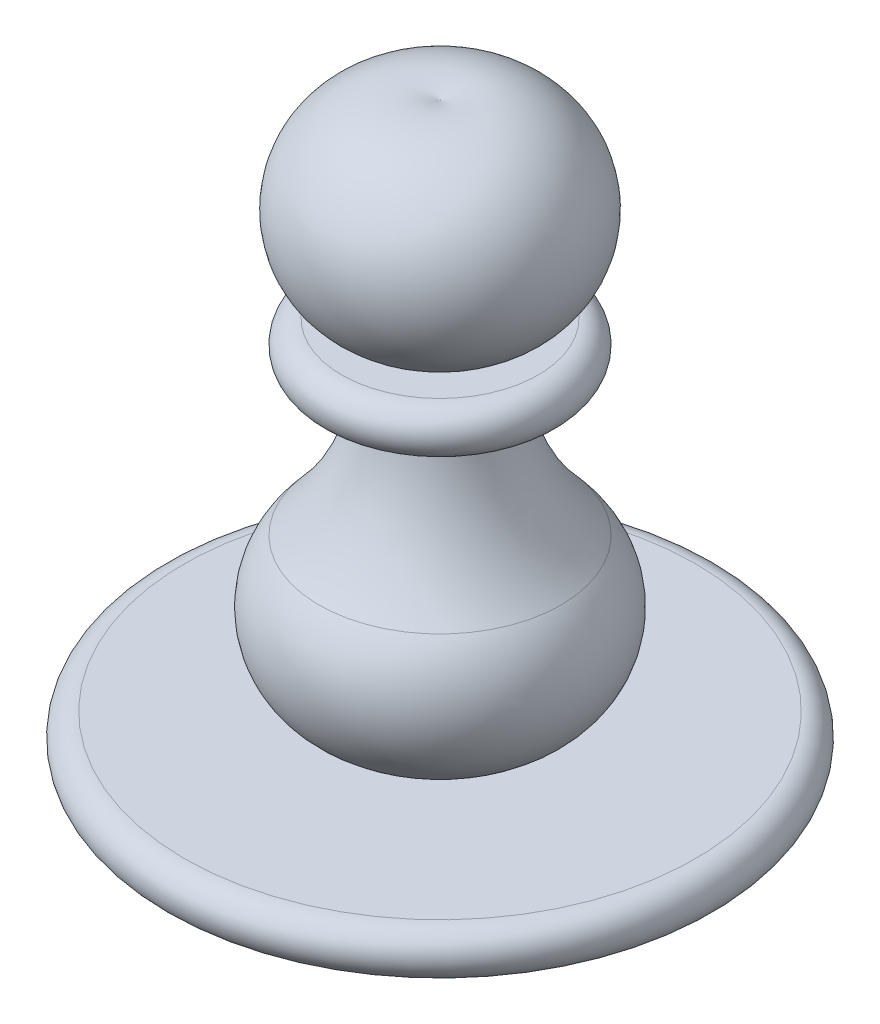
ISO-10303-21;
HEADER;
FILE_DESCRIPTION(('STEP AP214'),'2;1');
FILE_NAME('part.step','',(''),(''),'','','');
FILE_SCHEMA(('AUTOMOTIVE_DESIGN { 1 0 10303 214 1 1 1 1 }'));
ENDSEC;
DATA;
#1=APPLICATION_CONTEXT('core data for automotive mechanical design processes');
#2=APPLICATION_PROTOCOL_DEFINITION('international standard','automotive_design',2000,#1);
#3=PRODUCT_CONTEXT('',#1,'mechanical');
#4=PRODUCT('Part','Part','',(#3));
#5=PRODUCT_RELATED_PRODUCT_CATEGORY('part','',(#4));
#6=PRODUCT_DEFINITION_FORMATION('','',#4);
#7=PRODUCT_DEFINITION_CONTEXT('part definition',#1,'design');
#8=PRODUCT_DEFINITION('design','',#6,#7);
#9=PRODUCT_DEFINITION_SHAPE('','',#8);
#10=(LENGTH_UNIT() NAMED_UNIT(*) SI_UNIT(.MILLI.,.METRE.));
#11=(NAMED_UNIT(*) PLANE_ANGLE_UNIT() SI_UNIT($,.RADIAN.));
#12=(NAMED_UNIT(*) SI_UNIT($,.STERADIAN.) SOLID_ANGLE_UNIT());
#13=UNCERTAINTY_MEASURE_WITH_UNIT(LENGTH_MEASURE(1.E-05),#10,'distance_accuracy_value','');
#14=(GEOMETRIC_REPRESENTATION_CONTEXT(3) GLOBAL_UNCERTAINTY_ASSIGNED_CONTEXT((#13)) GLOBAL_UNIT_ASSIGNED_CONTEXT((#10,
#11,#12)) REPRESENTATION_CONTEXT('',''));
#15=CARTESIAN_POINT('',(0.,0.,0.));
#16=DIRECTION('',(0.,0.,1.));
#17=DIRECTION('',(1.,0.,0.));
#18=AXIS2_PLACEMENT_3D('',#15,#16,#17);
#19=CARTESIAN_POINT('',(0.,24.000000000002,0.));
#20=DIRECTION('',(0.,1.,0.));
#21=DIRECTION('',(-1.,0.,0.));
#22=AXIS2_PLACEMENT_3D('',#19,#20,#21);
#23=TOROIDAL_SURFACE('',#22,6.5,1.5);
#24=CARTESIAN_POINT('',(0.,25.500000000002,0.));
#25=DIRECTION('',(0.,1.,0.));
#26=DIRECTION('',(-1.,0.,0.));
#27=AXIS2_PLACEMENT_3D('',#24,#25,#26);
#28=CIRCLE('',#27,6.5);
#29=CARTESIAN_POINT('',(-6.50000000000009,25.500000000002,0.));
#30=VERTEX_POINT('',#29);
#31=EDGE_CURVE('E52',#30,#30,#28,.T.);
#32=ORIENTED_EDGE('',*,*,#31,.F.);
#33=EDGE_LOOP('',(#32));
#34=FACE_BOUND('',#33,.T.);
#35=CARTESIAN_POINT('',(0.,22.500000000002,0.));
#36=DIRECTION('',(0.,1.,0.));
#37=DIRECTION('',(-1.,0.,0.));
#38=AXIS2_PLACEMENT_3D('',#35,#36,#37);
#39=CIRCLE('',#38,6.5);
#40=CARTESIAN_POINT('',(-6.50000000000008,22.500000000002,0.));
#41=VERTEX_POINT('',#40);
#42=EDGE_CURVE('E11',#41,#41,#39,.F.);
#43=ORIENTED_EDGE('',*,*,#42,.F.);
#44=EDGE_LOOP('',(#43));
#45=FACE_BOUND('',#44,.T.);
#46=ADVANCED_FACE('F43',(#34,#45),#23,.T.);
#47=CARTESIAN_POINT('',(0.,1.5,0.));
#48=DIRECTION('',(0.,1.,0.));
#49=DIRECTION('',(0.,0.,1.));
#50=AXIS2_PLACEMENT_3D('',#47,#48,#49);
#51=TOROIDAL_SURFACE('',#50,16.8940971117105,1.5);
#52=CARTESIAN_POINT('',(0.,3.,0.));
#53=DIRECTION('',(0.,1.,0.));
#54=DIRECTION('',(0.,0.,1.));
#55=AXIS2_PLACEMENT_3D('',#52,#53,#54);
#56=CIRCLE('',#55,16.8940971117105);
#57=CARTESIAN_POINT('',(0.,3.,16.8940971117105));
#58=VERTEX_POINT('',#57);
#59=EDGE_CURVE('E91',#58,#58,#56,.T.);
#60=ORIENTED_EDGE('',*,*,#59,.F.);
#61=EDGE_LOOP('',(#60));
#62=FACE_BOUND('',#61,.T.);
#63=CARTESIAN_POINT('',(0.,0.,0.));
#64=DIRECTION('',(0.,1.,0.));
#65=DIRECTION('',(0.,0.,1.));
#66=AXIS2_PLACEMENT_3D('',#63,#64,#65);
#67=CIRCLE('',#66,16.8940971117105);
#68=CARTESIAN_POINT('',(0.,0.,16.8940971117105));
#69=VERTEX_POINT('',#68);
#70=EDGE_CURVE('E98',#69,#69,#67,.F.);
#71=ORIENTED_EDGE('',*,*,#70,.F.);
#72=EDGE_LOOP('',(#71));
#73=FACE_BOUND('',#72,.T.);
#74=ADVANCED_FACE('F69',(#62,#73),#51,.T.);
#75=CARTESIAN_POINT('',(0.,3.,0.));
#76=DIRECTION('',(0.,1.,0.));
#77=DIRECTION('',(0.,0.,1.));
#78=AXIS2_PLACEMENT_3D('',#75,#76,#77);
#79=PLANE('',#78);
#80=CARTESIAN_POINT('',(0.,3.,0.));
#81=DIRECTION('',(0.,1.,0.));
#82=DIRECTION('',(0.,0.,1.));
#83=AXIS2_PLACEMENT_3D('',#80,#81,#82);
#84=CIRCLE('',#83,3.99999999999991);
#85=CARTESIAN_POINT('',(0.,3.,3.99999999999991));
#86=VERTEX_POINT('',#85);
#87=EDGE_CURVE('E102',#86,#86,#84,.T.);
#88=ORIENTED_EDGE('',*,*,#87,.F.);
#89=EDGE_LOOP('',(#88));
#90=FACE_BOUND('',#89,.T.);
#91=ORIENTED_EDGE('',*,*,#59,.T.);
#92=EDGE_LOOP('',(#91));
#93=FACE_BOUND('',#92,.T.);
#94=ADVANCED_FACE('F74',(#90,#93),#79,.T.);
#95=CARTESIAN_POINT('',(0.,0.,0.));
#96=DIRECTION('',(0.,1.,0.));
#97=DIRECTION('',(0.,0.,1.));
#98=AXIS2_PLACEMENT_3D('',#95,#96,#97);
#99=PLANE('',#98);
#100=ORIENTED_EDGE('',*,*,#70,.T.);
#101=EDGE_LOOP('',(#100));
#102=FACE_BOUND('',#101,.T.);
#103=ADVANCED_FACE('F120',(#102),#99,.F.);
#104=CARTESIAN_POINT('',(0.,23.29634356185,0.));
#105=DIRECTION('',(0.,-1.,0.));
#106=DIRECTION('',(1.,0.,0.));
#107=AXIS2_PLACEMENT_3D('',#104,#105,#106);
#108=TOROIDAL_SURFACE('',#107,18.9788463151038,15.);
#109=CARTESIAN_POINT('',(0.,22.5,0.));
#110=DIRECTION('',(0.,-1.,0.));
#111=DIRECTION('',(1.,0.,0.));
#112=AXIS2_PLACEMENT_3D('',#109,#110,#111);
#113=CIRCLE('',#112,3.99999999999992);
#114=CARTESIAN_POINT('',(3.99999999999984,22.5,0.));
#115=VERTEX_POINT('',#114);
#116=EDGE_CURVE('E83',#115,#115,#113,.T.);
#117=ORIENTED_EDGE('',*,*,#116,.T.);
#118=EDGE_LOOP('',(#117));
#119=FACE_BOUND('',#118,.T.);
#120=CARTESIAN_POINT('',(0.,13.0755347098398,0.));
#121=DIRECTION('',(0.,-1.,0.));
#122=DIRECTION('',(1.,0.,0.));
#123=AXIS2_PLACEMENT_3D('',#120,#121,#122);
#124=CIRCLE('',#123,7.99999999999995);
#125=CARTESIAN_POINT('',(7.99999999999991,13.0755347098398,0.));
#126=VERTEX_POINT('',#125);
#127=EDGE_CURVE('E86',#126,#126,#124,.T.);
#128=ORIENTED_EDGE('',*,*,#127,.F.);
#129=EDGE_LOOP('',(#128));
#130=FACE_BOUND('',#129,.T.);
#131=ADVANCED_FACE('F114',(#119,#130),#108,.F.);
#132=CARTESIAN_POINT('',(0.,8.98721116903565,0.));
#133=DIRECTION('',(0.,-1.,0.));
#134=DIRECTION('',(1.,0.,0.));
#135=AXIS2_PLACEMENT_3D('',#132,#133,#134);
#136=DEGENERATE_TOROIDAL_SURFACE('',#135,3.60846147395842,6.,.T.);
#137=ORIENTED_EDGE('',*,*,#127,.T.);
#138=EDGE_LOOP('',(#137));
#139=FACE_BOUND('',#138,.T.);
#140=ORIENTED_EDGE('',*,*,#87,.T.);
#141=EDGE_LOOP('',(#140));
#142=FACE_BOUND('',#141,.T.);
#143=ADVANCED_FACE('F109',(#139,#142),#136,.T.);
#144=CARTESIAN_POINT('',(0.,25.500000000002,0.));
#145=DIRECTION('',(0.,1.,0.));
#146=DIRECTION('',(-1.,0.,0.));
#147=AXIS2_PLACEMENT_3D('',#144,#145,#146);
#148=PLANE('',#147);
#149=CARTESIAN_POINT('',(0.,25.500000000002,0.));
#150=DIRECTION('',(0.,1.,0.));
#151=DIRECTION('',(-1.,0.,0.));
#152=AXIS2_PLACEMENT_3D('',#149,#150,#151);
#153=CIRCLE('',#152,3.80205660988968);
#154=CARTESIAN_POINT('',(-3.80205660988977,25.500000000002,0.));
#155=VERTEX_POINT('',#154);
#156=EDGE_CURVE('E47',#155,#155,#153,.F.);
#157=ORIENTED_EDGE('',*,*,#156,.T.);
#158=EDGE_LOOP('',(#157));
#159=FACE_BOUND('',#158,.T.);
#160=ORIENTED_EDGE('',*,*,#31,.T.);
#161=EDGE_LOOP('',(#160));
#162=FACE_BOUND('',#161,.T.);
#163=ADVANCED_FACE('F63',(#159,#162),#148,.T.);
#164=CARTESIAN_POINT('',(0.,22.500000000002,0.));
#165=DIRECTION('',(0.,1.,0.));
#166=DIRECTION('',(-1.,0.,0.));
#167=AXIS2_PLACEMENT_3D('',#164,#165,#166);
#168=PLANE('',#167);
#169=ORIENTED_EDGE('',*,*,#42,.T.);
#170=EDGE_LOOP('',(#169));
#171=FACE_BOUND('',#170,.T.);
#172=ORIENTED_EDGE('',*,*,#116,.F.);
#173=EDGE_LOOP('',(#172));
#174=FACE_BOUND('',#173,.T.);
#175=ADVANCED_FACE('F57',(#171,#174),#168,.F.);
#176=CARTESIAN_POINT('',(1.90102830494472,31.7500000001084,0.));
#177=DIRECTION('',(0.,0.,-1.));
#178=DIRECTION('',(1.,0.,0.));
#179=AXIS2_PLACEMENT_3D('',#176,#177,#178);
#180=CIRCLE('',#179,6.53271831763247);
#181=TRIMMED_CURVE('',#180,(PARAMETER_VALUE(-1.86606939711813)),
(PARAMETER_VALUE(1.86606939711813)),.T.,.PARAMETER.);
#182=CARTESIAN_POINT('',(-1.10805462028019E-13,31.7500000001083,0.));
#183=DIRECTION('',(0.,-1.,0.));
#184=AXIS1_PLACEMENT('',#182,#183);
#185=SURFACE_OF_REVOLUTION('',#181,#184);
#186=ORIENTED_EDGE('',*,*,#156,.F.);
#187=EDGE_LOOP('',(#186));
#188=FACE_BOUND('',#187,.T.);
#189=CARTESIAN_POINT('',(6.99273581414692E-10,38.000000000002,0.));
#190=VERTEX_POINT('',#189);
#191=VERTEX_LOOP('',#190);
#192=FACE_BOUND('',#191,.T.);
#193=ADVANCED_FACE('F55',(#188,#192),#185,.T.);
#194=CLOSED_SHELL('',(#46,#74,#94,#103,#131,#143,#163,#175,#193));
#195=MANIFOLD_SOLID_BREP('B2',#194);
#196=ADVANCED_BREP_SHAPE_REPRESENTATION('',(#18,#195),#14);
#197=SHAPE_DEFINITION_REPRESENTATION(#9,#196);
ENDSEC;
END-ISO-10303-21;
